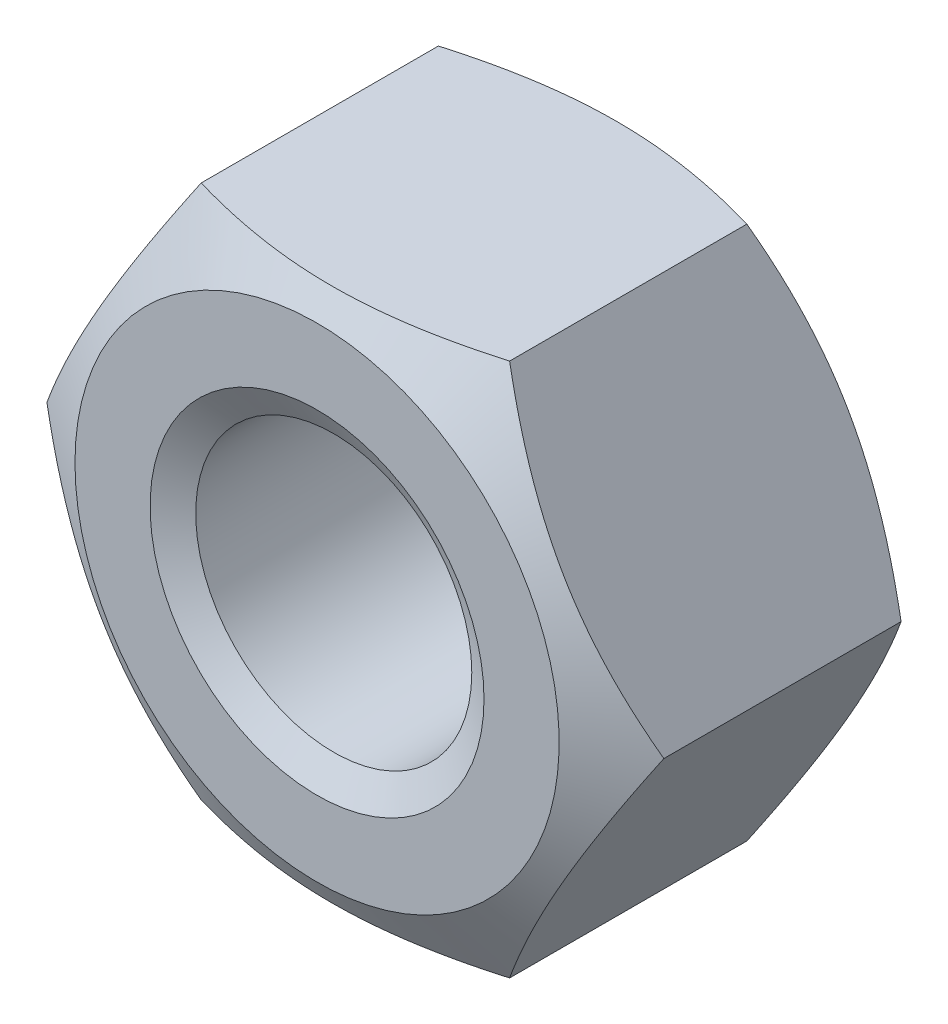
ISO-10303-21;
HEADER;
FILE_DESCRIPTION(('STEP AP214'),'2;1');
FILE_NAME('part.step','',(''),(''),'','','');
FILE_SCHEMA(('AUTOMOTIVE_DESIGN { 1 0 10303 214 1 1 1 1 }'));
ENDSEC;
DATA;
#1=APPLICATION_CONTEXT('core data for automotive mechanical design processes');
#2=APPLICATION_PROTOCOL_DEFINITION('international standard','automotive_design',2000,#1);
#3=PRODUCT_CONTEXT('',#1,'mechanical');
#4=PRODUCT('Part','Part','',(#3));
#5=PRODUCT_RELATED_PRODUCT_CATEGORY('part','',(#4));
#6=PRODUCT_DEFINITION_FORMATION('','',#4);
#7=PRODUCT_DEFINITION_CONTEXT('part definition',#1,'design');
#8=PRODUCT_DEFINITION('design','',#6,#7);
#9=PRODUCT_DEFINITION_SHAPE('','',#8);
#10=(LENGTH_UNIT() NAMED_UNIT(*) SI_UNIT(.MILLI.,.METRE.));
#11=(NAMED_UNIT(*) PLANE_ANGLE_UNIT() SI_UNIT($,.RADIAN.));
#12=(NAMED_UNIT(*) SI_UNIT($,.STERADIAN.) SOLID_ANGLE_UNIT());
#13=UNCERTAINTY_MEASURE_WITH_UNIT(LENGTH_MEASURE(1.E-05),#10,'distance_accuracy_value','');
#14=(GEOMETRIC_REPRESENTATION_CONTEXT(3) GLOBAL_UNCERTAINTY_ASSIGNED_CONTEXT((#13)) GLOBAL_UNIT_ASSIGNED_CONTEXT((#10,
#11,#12)) REPRESENTATION_CONTEXT('',''));
#15=CARTESIAN_POINT('',(0.,0.,0.));
#16=DIRECTION('',(0.,0.,1.));
#17=DIRECTION('',(1.,0.,0.));
#18=AXIS2_PLACEMENT_3D('',#15,#16,#17);
#19=CARTESIAN_POINT('',(2.3094010767585,-4.,-4.7));
#20=DIRECTION('',(0.866025403784439,-0.5,0.));
#21=DIRECTION('',(0.5,0.866025403784439,0.));
#22=AXIS2_PLACEMENT_3D('',#19,#20,#21);
#23=PLANE('',#22);
#24=CARTESIAN_POINT('',(2.30928560670466,-4.0002,-0.573838610020869));
#25=CARTESIAN_POINT('',(2.4107717464617,-3.82442084967677,-0.515224224594386));
#26=CARTESIAN_POINT('',(2.51313390883499,-3.64712438367362,-0.461916672408366));
#27=CARTESIAN_POINT('',(2.71963072479811,-3.28946140682429,-0.368868021692508));
#28=CARTESIAN_POINT('',(2.82376904741904,-3.10908854102985,-0.32915983997581));
#29=CARTESIAN_POINT('',(3.03075510011795,-2.75057818129721,-0.267348566226385));
#30=CARTESIAN_POINT('',(3.13357098372491,-2.57249584706486,-0.244834082468995));
#31=CARTESIAN_POINT('',(3.33968651028528,-2.21549328283349,-0.217956974092688));
#32=CARTESIAN_POINT('',(3.44298540411434,-2.0365743503559,-0.21357209237305));
#33=CARTESIAN_POINT('',(3.63600352522932,-1.70225715780327,-0.222696423886076));
#34=CARTESIAN_POINT('',(3.72575165335064,-1.54680884001294,-0.2339653049341));
#35=CARTESIAN_POINT('',(3.90466320392054,-1.23692494436495,-0.269680341744298));
#36=CARTESIAN_POINT('',(3.99382600759478,-1.08249043825587,-0.294138696657638));
#37=CARTESIAN_POINT('',(4.17310641015197,-0.771967672225422,-0.355282415865394));
#38=CARTESIAN_POINT('',(4.26320131938131,-0.615918711936898,-0.392226954600968));
#39=CARTESIAN_POINT('',(4.4420474282755,-0.30614816459616,-0.476076423494131));
#40=CARTESIAN_POINT('',(4.53080091904966,-0.15242260922622,-0.522961653158843));
#41=CARTESIAN_POINT('',(4.61891762357084,0.000200000000000348,-0.57383861002087));
#42=B_SPLINE_CURVE_WITH_KNOTS('',3,(#24,#25,#26,#27,#28,#29,#30,#31,#32,#33,#34,#35,#36,#37,#38,
#39,#40,#41),.UNSPECIFIED.,.F.,.F.,(4,2,2,2,2,2,2,2,4),(0.,0.634047835695965,1.26961969224543,
1.88946157213122,2.50854226669297,3.04757825393385,3.58711366126903,4.13861653143764,
4.68903648037743),.UNSPECIFIED.);
#43=CARTESIAN_POINT('',(2.30940107675851,-4.,-0.573771940854268));
#44=VERTEX_POINT('',#43);
#45=CARTESIAN_POINT('',(4.618802153517,0.,-0.573771940854268));
#46=VERTEX_POINT('',#45);
#47=EDGE_CURVE('E51',#44,#46,#42,.T.);
#48=ORIENTED_EDGE('',*,*,#47,.F.);
#49=DIRECTION('',(0.,0.,1.));
#50=VECTOR('',#49,1.);
#51=CARTESIAN_POINT('',(2.3094010767585,-4.,-4.7));
#52=LINE('',#51,#50);
#53=CARTESIAN_POINT('',(2.30940107675851,-4.,-4.12622805914573));
#54=VERTEX_POINT('',#53);
#55=EDGE_CURVE('E115',#54,#44,#52,.T.);
#56=ORIENTED_EDGE('',*,*,#55,.F.);
#57=CARTESIAN_POINT('',(4.61891762357084,0.000200000000000429,-4.12616138997913));
#58=CARTESIAN_POINT('',(4.5174314838138,-0.175579150323227,-4.18477577540562));
#59=CARTESIAN_POINT('',(4.41506932144051,-0.35287561632638,-4.23808332759163));
#60=CARTESIAN_POINT('',(4.20857250547739,-0.710538593175705,-4.33113197830749));
#61=CARTESIAN_POINT('',(4.10443418285647,-0.890911458970149,-4.37084016002419));
#62=CARTESIAN_POINT('',(3.89744813015756,-1.24942181870279,-4.43265143377362));
#63=CARTESIAN_POINT('',(3.79463224655059,-1.42750415293514,-4.45516591753101));
#64=CARTESIAN_POINT('',(3.58851671999023,-1.78450671716651,-4.48204302590731));
#65=CARTESIAN_POINT('',(3.48521782616117,-1.9634256496441,-4.48642790762695));
#66=CARTESIAN_POINT('',(3.29219970504619,-2.29774284219673,-4.47730357611392));
#67=CARTESIAN_POINT('',(3.20245157692486,-2.45319115998706,-4.4660346950659));
#68=CARTESIAN_POINT('',(3.02354002635497,-2.76307505563505,-4.4303196582557));
#69=CARTESIAN_POINT('',(2.93437722268072,-2.91750956174413,-4.40586130334236));
#70=CARTESIAN_POINT('',(2.75509682012354,-3.22803232777458,-4.34471758413461));
#71=CARTESIAN_POINT('',(2.6650019108942,-3.3840812880631,-4.30777304539903));
#72=CARTESIAN_POINT('',(2.48615580200001,-3.69385183540384,-4.22392357650587));
#73=CARTESIAN_POINT('',(2.39740231122585,-3.84757739077378,-4.17703834684116));
#74=CARTESIAN_POINT('',(2.30928560670466,-4.0002,-4.12616138997913));
#75=B_SPLINE_CURVE_WITH_KNOTS('',3,(#57,#58,#59,#60,#61,#62,#63,#64,#65,#66,#67,#68,#69,#70,#71,
#72,#73,#74),.UNSPECIFIED.,.F.,.F.,(4,2,2,2,2,2,2,2,4),(0.,0.634047835695965,1.26961969224543,
1.88946157213122,2.50854226669297,3.04757825393385,3.58711366126903,4.13861653143764,
4.68903648037743),.UNSPECIFIED.);
#76=CARTESIAN_POINT('',(4.61880215351701,0.,-4.12622805914573));
#77=VERTEX_POINT('',#76);
#78=EDGE_CURVE('E126',#77,#54,#75,.T.);
#79=ORIENTED_EDGE('',*,*,#78,.F.);
#80=DIRECTION('',(0.,0.,1.));
#81=VECTOR('',#80,1.);
#82=CARTESIAN_POINT('',(4.618802153517,0.,-4.7));
#83=LINE('',#82,#81);
#84=EDGE_CURVE('E123',#77,#46,#83,.T.);
#85=ORIENTED_EDGE('',*,*,#84,.T.);
#86=EDGE_LOOP('',(#48,#56,#79,#85));
#87=FACE_BOUND('',#86,.T.);
#88=ADVANCED_FACE('F36',(#87),#23,.T.);
#89=CARTESIAN_POINT('',(-2.30940107675851,-4.,-4.7));
#90=DIRECTION('',(0.,-1.,0.));
#91=DIRECTION('',(0.,0.,-1.));
#92=AXIS2_PLACEMENT_3D('',#89,#90,#91);
#93=PLANE('',#92);
#94=CARTESIAN_POINT('',(-6.09489331698854,-4.,-2.11613226172566));
#95=CARTESIAN_POINT('',(-5.91950199157587,-4.,-2.03149845459354));
#96=CARTESIAN_POINT('',(-5.74369257215839,-4.,-1.94771521780252));
#97=CARTESIAN_POINT('',(-5.39101133395399,-4.,-1.78233664211192));
#98=CARTESIAN_POINT('',(-5.21413933441671,-4.,-1.70074168913585));
#99=CARTESIAN_POINT('',(-4.85813636500876,-4.,-1.5397900151928));
#100=CARTESIAN_POINT('',(-4.67899824046454,-4.,-1.46044906153752));
#101=CARTESIAN_POINT('',(-4.31923849988323,-4.,-1.3052185148072));
#102=CARTESIAN_POINT('',(-4.13861696282555,-4.,-1.22932873937403));
#103=CARTESIAN_POINT('',(-3.7735011480398,-4.,-1.08107583924949));
#104=CARTESIAN_POINT('',(-3.58898622005784,-4.,-1.00876328992995));
#105=CARTESIAN_POINT('',(-3.21776937752919,-4.,-0.869876931081914));
#106=CARTESIAN_POINT('',(-3.03106722115794,-4.,-0.803303763044691));
#107=CARTESIAN_POINT('',(-2.65557248328835,-4.,-0.677706911420484));
#108=CARTESIAN_POINT('',(-2.46678541613765,-4.,-0.618666911849643));
#109=CARTESIAN_POINT('',(-2.08652902254126,-4.,-0.510073166124485));
#110=CARTESIAN_POINT('',(-1.8950605731911,-4.,-0.460516392299832));
#111=CARTESIAN_POINT('',(-1.50929874076661,-4.,-0.373311085934224));
#112=CARTESIAN_POINT('',(-1.31500426032993,-4.,-0.335667315782001));
#113=CARTESIAN_POINT('',(-0.924106700196859,-4.,-0.274847986643175));
#114=CARTESIAN_POINT('',(-0.727503612751564,-4.,-0.251672476233862));
#115=CARTESIAN_POINT('',(-0.33424068105691,-4.,-0.221840557573746));
#116=CARTESIAN_POINT('',(-0.137588730976598,-4.,-0.215082720352835));
#117=CARTESIAN_POINT('',(0.255527926525663,-4.,-0.218431875319074));
#118=CARTESIAN_POINT('',(0.451992668517271,-4.,-0.22853464227679));
#119=CARTESIAN_POINT('',(0.788354694254841,-4.,-0.259560117675916));
#120=CARTESIAN_POINT('',(0.928625472737156,-4.,-0.276641969876922));
#121=CARTESIAN_POINT('',(1.20806274563188,-4.,-0.318274124275841));
#122=CARTESIAN_POINT('',(1.34722906903656,-4.,-0.342825560735152));
#123=CARTESIAN_POINT('',(1.7632975044686,-4.,-0.426460434693978));
#124=CARTESIAN_POINT('',(2.03822284110857,-4.,-0.495467674952662));
#125=CARTESIAN_POINT('',(2.44940900931328,-4.,-0.614199979523692));
#126=CARTESIAN_POINT('',(2.58782303777094,-4.,-0.65688505084322));
#127=CARTESIAN_POINT('',(2.86331367399499,-4.,-0.746448608551733));
#128=CARTESIAN_POINT('',(3.00039016121332,-4.,-0.793327469111019));
#129=CARTESIAN_POINT('',(3.27252112795078,-4.,-0.89027873080736));
#130=CARTESIAN_POINT('',(3.40758266486629,-4.,-0.940331521678568));
#131=CARTESIAN_POINT('',(3.67656082616028,-4.,-1.04329523164377));
#132=CARTESIAN_POINT('',(3.81047782797028,-4.,-1.09620516281665));
#133=CARTESIAN_POINT('',(3.94391362275131,-4.,-1.15027525964541));
#134=B_SPLINE_CURVE_WITH_KNOTS('',3,(#94,#95,#96,#97,#98,#99,#100,#101,#102,#103,#104,#105,#106,
#107,#108,#109,#110,#111,#112,#113,#114,#115,#116,#117,#118,#119,#120,#121,#122,#123,#124,#125,
#126,#127,#128,#129,#130,#131,#132,#133),.UNSPECIFIED.,.F.,.F.,(4,2,2,2,2,2,2,2,2,2,2,2,2,2,2,2,
2,2,2,4),(0.,0.58423826026917,1.1685788875296,1.7563161578612,2.34402233634429,2.93848518113534,
3.53301438319362,4.12623321773499,4.71926234060198,5.31252823650209,5.90579612428623,
6.4953893548323,7.08483485682727,7.5085487103983,7.93232693734392,8.78152355201764,
9.21602908260414,9.65057341855462,10.0826543795838,10.5145868837227),.UNSPECIFIED.);
#135=CARTESIAN_POINT('',(-2.3094010767585,-4.,-0.573771940854268));
#136=VERTEX_POINT('',#135);
#137=EDGE_CURVE('E108',#136,#44,#134,.T.);
#138=ORIENTED_EDGE('',*,*,#137,.F.);
#139=DIRECTION('',(0.,0.,1.));
#140=VECTOR('',#139,1.);
#141=CARTESIAN_POINT('',(-2.30940107675851,-4.,-4.7));
#142=LINE('',#141,#140);
#143=CARTESIAN_POINT('',(-2.3094010767585,-4.00000000000001,-4.12622805914573));
#144=VERTEX_POINT('',#143);
#145=EDGE_CURVE('E107',#144,#136,#142,.T.);
#146=ORIENTED_EDGE('',*,*,#145,.F.);
#147=CARTESIAN_POINT('',(-6.09489331698854,-4.,-2.58386773827435));
#148=CARTESIAN_POINT('',(-5.91950199157587,-4.,-2.66850154540646));
#149=CARTESIAN_POINT('',(-5.74369257215839,-4.,-2.75228478219748));
#150=CARTESIAN_POINT('',(-5.39101133395399,-4.,-2.91766335788808));
#151=CARTESIAN_POINT('',(-5.21413933441671,-4.,-2.99925831086415));
#152=CARTESIAN_POINT('',(-4.85813636500876,-4.,-3.1602099848072));
#153=CARTESIAN_POINT('',(-4.67899824046454,-4.,-3.23955093846249));
#154=CARTESIAN_POINT('',(-4.31923849988323,-4.,-3.3947814851928));
#155=CARTESIAN_POINT('',(-4.13861696282555,-4.,-3.47067126062598));
#156=CARTESIAN_POINT('',(-3.7735011480398,-4.,-3.61892416075051));
#157=CARTESIAN_POINT('',(-3.58898622005784,-4.,-3.69123671007006));
#158=CARTESIAN_POINT('',(-3.21776937752919,-4.,-3.83012306891809));
#159=CARTESIAN_POINT('',(-3.03106722115794,-4.,-3.89669623695531));
#160=CARTESIAN_POINT('',(-2.65557248328835,-4.,-4.02229308857952));
#161=CARTESIAN_POINT('',(-2.46678541613765,-4.,-4.08133308815036));
#162=CARTESIAN_POINT('',(-2.08652902254126,-4.,-4.18992683387552));
#163=CARTESIAN_POINT('',(-1.8950605731911,-4.,-4.23948360770017));
#164=CARTESIAN_POINT('',(-1.50929874076661,-4.,-4.32668891406578));
#165=CARTESIAN_POINT('',(-1.31500426032993,-4.,-4.364332684218));
#166=CARTESIAN_POINT('',(-0.924106700196859,-4.,-4.42515201335682));
#167=CARTESIAN_POINT('',(-0.727503612751564,-4.,-4.44832752376614));
#168=CARTESIAN_POINT('',(-0.334240681056911,-4.,-4.47815944242625));
#169=CARTESIAN_POINT('',(-0.137588730976599,-4.,-4.48491727964717));
#170=CARTESIAN_POINT('',(0.255527926525662,-4.,-4.48156812468093));
#171=CARTESIAN_POINT('',(0.45199266851727,-4.,-4.47146535772321));
#172=CARTESIAN_POINT('',(0.78835469425484,-4.,-4.44043988232409));
#173=CARTESIAN_POINT('',(0.928625472737156,-4.,-4.42335803012308));
#174=CARTESIAN_POINT('',(1.20806274563188,-4.,-4.38172587572416));
#175=CARTESIAN_POINT('',(1.34722906903656,-4.,-4.35717443926485));
#176=CARTESIAN_POINT('',(1.7632975044686,-4.,-4.27353956530602));
#177=CARTESIAN_POINT('',(2.03822284110857,-4.,-4.20453232504734));
#178=CARTESIAN_POINT('',(2.44940900931328,-4.,-4.08580002047631));
#179=CARTESIAN_POINT('',(2.58782303777094,-4.,-4.04311494915678));
#180=CARTESIAN_POINT('',(2.86331367399499,-4.,-3.95355139144827));
#181=CARTESIAN_POINT('',(3.00039016121333,-4.,-3.90667253088898));
#182=CARTESIAN_POINT('',(3.27252112795078,-4.,-3.80972126919264));
#183=CARTESIAN_POINT('',(3.4075826648663,-4.,-3.75966847832143));
#184=CARTESIAN_POINT('',(3.67656082616028,-4.,-3.65670476835623));
#185=CARTESIAN_POINT('',(3.81047782797029,-4.,-3.60379483718335));
#186=CARTESIAN_POINT('',(3.94391362275132,-4.,-3.54972474035459));
#187=B_SPLINE_CURVE_WITH_KNOTS('',3,(#147,#148,#149,#150,#151,#152,#153,#154,#155,#156,#157,
#158,#159,#160,#161,#162,#163,#164,#165,#166,#167,#168,#169,#170,#171,#172,#173,#174,#175,#176,
#177,#178,#179,#180,#181,#182,#183,#184,#185,#186),.UNSPECIFIED.,.F.,.F.,(4,2,2,2,2,2,2,2,2,2,2,
2,2,2,2,2,2,2,2,4),(0.,0.584238260269169,1.1685788875296,1.7563161578612,2.34402233634429,
2.93848518113534,3.53301438319362,4.12623321773499,4.71926234060197,5.31252823650208,
5.90579612428623,6.4953893548323,7.08483485682726,7.5085487103983,7.93232693734391,
8.78152355201763,9.21602908260414,9.65057341855462,10.0826543795838,10.5145868837227),.UNSPECIFIED.);
#188=EDGE_CURVE('E202',#54,#144,#187,.F.);
#189=ORIENTED_EDGE('',*,*,#188,.F.);
#190=ORIENTED_EDGE('',*,*,#55,.T.);
#191=EDGE_LOOP('',(#138,#146,#189,#190));
#192=FACE_BOUND('',#191,.T.);
#193=ADVANCED_FACE('F212',(#192),#93,.T.);
#194=CARTESIAN_POINT('',(-4.61880215351701,0.,-4.7));
#195=DIRECTION('',(-0.866025403784439,-0.5,0.));
#196=DIRECTION('',(0.5,-0.866025403784439,0.));
#197=AXIS2_PLACEMENT_3D('',#194,#195,#196);
#198=PLANE('',#197);
#199=CARTESIAN_POINT('',(-4.61891762357085,0.000200000000001723,-0.573838610020873));
#200=CARTESIAN_POINT('',(-4.51743148381381,-0.175579150323226,-0.515224224594388));
#201=CARTESIAN_POINT('',(-4.41506932144052,-0.352875616326379,-0.461916672408369));
#202=CARTESIAN_POINT('',(-4.2085725054774,-0.710538593175704,-0.368868021692511));
#203=CARTESIAN_POINT('',(-4.10443418285647,-0.890911458970149,-0.329159839975812));
#204=CARTESIAN_POINT('',(-3.89744813015756,-1.24942181870279,-0.267348566226387));
#205=CARTESIAN_POINT('',(-3.7946322465506,-1.42750415293514,-0.244834082468997));
#206=CARTESIAN_POINT('',(-3.58851671999023,-1.78450671716651,-0.21795697409269));
#207=CARTESIAN_POINT('',(-3.48521782616117,-1.9634256496441,-0.213572092373051));
#208=CARTESIAN_POINT('',(-3.29219970504619,-2.29774284219673,-0.222696423886078));
#209=CARTESIAN_POINT('',(-3.20245157692487,-2.45319115998706,-0.233965304934101));
#210=CARTESIAN_POINT('',(-3.02354002635497,-2.76307505563505,-0.2696803417443));
#211=CARTESIAN_POINT('',(-2.93437722268073,-2.91750956174413,-0.294138696657639));
#212=CARTESIAN_POINT('',(-2.75509682012354,-3.22803232777458,-0.355282415865395));
#213=CARTESIAN_POINT('',(-2.6650019108942,-3.3840812880631,-0.392226954600969));
#214=CARTESIAN_POINT('',(-2.48615580200001,-3.69385183540384,-0.476076423494131));
#215=CARTESIAN_POINT('',(-2.39740231122585,-3.84757739077378,-0.522961653158844));
#216=CARTESIAN_POINT('',(-2.30928560670467,-4.0002,-0.57383861002087));
#217=B_SPLINE_CURVE_WITH_KNOTS('',3,(#199,#200,#201,#202,#203,#204,#205,#206,#207,#208,#209,
#210,#211,#212,#213,#214,#215,#216),.UNSPECIFIED.,.F.,.F.,(4,2,2,2,2,2,2,2,4),(0.,
0.634047835695965,1.26961969224543,1.88946157213122,2.50854226669297,3.04757825393386,
3.58711366126903,4.13861653143764,4.68903648037743),.UNSPECIFIED.);
#218=CARTESIAN_POINT('',(-4.61880215351701,0.,-0.573771940854268));
#219=VERTEX_POINT('',#218);
#220=EDGE_CURVE('E91',#219,#136,#217,.T.);
#221=ORIENTED_EDGE('',*,*,#220,.F.);
#222=DIRECTION('',(0.,0.,1.));
#223=VECTOR('',#222,1.);
#224=CARTESIAN_POINT('',(-4.61880215351701,0.,-4.7));
#225=LINE('',#224,#223);
#226=CARTESIAN_POINT('',(-4.61880215351701,0.,-4.12622805914573));
#227=VERTEX_POINT('',#226);
#228=EDGE_CURVE('E105',#227,#219,#225,.T.);
#229=ORIENTED_EDGE('',*,*,#228,.F.);
#230=CARTESIAN_POINT('',(-2.30928560670467,-4.0002,-4.12616138997913));
#231=CARTESIAN_POINT('',(-2.41077174646171,-3.82442084967677,-4.18477577540561));
#232=CARTESIAN_POINT('',(-2.513133908835,-3.64712438367362,-4.23808332759163));
#233=CARTESIAN_POINT('',(-2.71963072479812,-3.28946140682429,-4.33113197830749));
#234=CARTESIAN_POINT('',(-2.82376904741904,-3.10908854102985,-4.37084016002419));
#235=CARTESIAN_POINT('',(-3.03075510011795,-2.75057818129721,-4.43265143377361));
#236=CARTESIAN_POINT('',(-3.13357098372492,-2.57249584706486,-4.455165917531));
#237=CARTESIAN_POINT('',(-3.33968651028528,-2.21549328283349,-4.48204302590731));
#238=CARTESIAN_POINT('',(-3.44298540411434,-2.0365743503559,-4.48642790762695));
#239=CARTESIAN_POINT('',(-3.63600352522932,-1.70225715780327,-4.47730357611392));
#240=CARTESIAN_POINT('',(-3.72575165335065,-1.54680884001294,-4.4660346950659));
#241=CARTESIAN_POINT('',(-3.90466320392054,-1.23692494436494,-4.4303196582557));
#242=CARTESIAN_POINT('',(-3.99382600759479,-1.08249043825587,-4.40586130334236));
#243=CARTESIAN_POINT('',(-4.17310641015197,-0.771967672225422,-4.3447175841346));
#244=CARTESIAN_POINT('',(-4.26320131938131,-0.615918711936897,-4.30777304539903));
#245=CARTESIAN_POINT('',(-4.44204742827551,-0.30614816459616,-4.22392357650587));
#246=CARTESIAN_POINT('',(-4.53080091904967,-0.15242260922622,-4.17703834684115));
#247=CARTESIAN_POINT('',(-4.61891762357085,0.000200000000001465,-4.12616138997913));
#248=B_SPLINE_CURVE_WITH_KNOTS('',3,(#230,#231,#232,#233,#234,#235,#236,#237,#238,#239,#240,
#241,#242,#243,#244,#245,#246,#247),.UNSPECIFIED.,.F.,.F.,(4,2,2,2,2,2,2,2,4),(0.,
0.634047835695965,1.26961969224543,1.88946157213122,2.50854226669297,3.04757825393385,
3.58711366126903,4.13861653143764,4.68903648037743),.UNSPECIFIED.);
#249=EDGE_CURVE('E195',#144,#227,#248,.T.);
#250=ORIENTED_EDGE('',*,*,#249,.F.);
#251=ORIENTED_EDGE('',*,*,#145,.T.);
#252=EDGE_LOOP('',(#221,#229,#250,#251));
#253=FACE_BOUND('',#252,.T.);
#254=ADVANCED_FACE('F103',(#253),#198,.T.);
#255=CARTESIAN_POINT('',(-2.30940107675851,4.,-4.7));
#256=DIRECTION('',(-0.866025403784439,0.5,0.));
#257=DIRECTION('',(-0.5,-0.866025403784439,0.));
#258=AXIS2_PLACEMENT_3D('',#255,#256,#257);
#259=PLANE('',#258);
#260=CARTESIAN_POINT('',(-2.30928560670467,4.0002,-0.573838610020872));
#261=CARTESIAN_POINT('',(-2.41077174646171,3.82442084967677,-0.515224224594388));
#262=CARTESIAN_POINT('',(-2.513133908835,3.64712438367362,-0.461916672408369));
#263=CARTESIAN_POINT('',(-2.71963072479812,3.28946140682429,-0.368868021692511));
#264=CARTESIAN_POINT('',(-2.82376904741905,3.10908854102985,-0.329159839975812));
#265=CARTESIAN_POINT('',(-3.03075510011795,2.75057818129721,-0.267348566226387));
#266=CARTESIAN_POINT('',(-3.13357098372492,2.57249584706486,-0.244834082468998));
#267=CARTESIAN_POINT('',(-3.33968651028529,2.21549328283349,-0.217956974092691));
#268=CARTESIAN_POINT('',(-3.44298540411434,2.0365743503559,-0.213572092373052));
#269=CARTESIAN_POINT('',(-3.63600352522933,1.70225715780327,-0.222696423886079));
#270=CARTESIAN_POINT('',(-3.72575165335065,1.54680884001294,-0.233965304934103));
#271=CARTESIAN_POINT('',(-3.90466320392055,1.23692494436495,-0.269680341744302));
#272=CARTESIAN_POINT('',(-3.99382600759479,1.08249043825587,-0.294138696657641));
#273=CARTESIAN_POINT('',(-4.17310641015197,0.771967672225423,-0.355282415865397));
#274=CARTESIAN_POINT('',(-4.26320131938131,0.6159187119369,-0.392226954600971));
#275=CARTESIAN_POINT('',(-4.44204742827551,0.306148164596163,-0.476076423494134));
#276=CARTESIAN_POINT('',(-4.53080091904967,0.152422609226223,-0.522961653158847));
#277=CARTESIAN_POINT('',(-4.61891762357085,-0.000199999999998026,-0.573838610020872));
#278=B_SPLINE_CURVE_WITH_KNOTS('',3,(#260,#261,#262,#263,#264,#265,#266,#267,#268,#269,#270,
#271,#272,#273,#274,#275,#276,#277),.UNSPECIFIED.,.F.,.F.,(4,2,2,2,2,2,2,2,4),(0.,
0.634047835695965,1.26961969224543,1.88946157213122,2.50854226669297,3.04757825393385,
3.58711366126903,4.13861653143763,4.68903648037743),.UNSPECIFIED.);
#279=CARTESIAN_POINT('',(-2.30940107675851,4.,-0.573771940854268));
#280=VERTEX_POINT('',#279);
#281=EDGE_CURVE('E87',#280,#219,#278,.T.);
#282=ORIENTED_EDGE('',*,*,#281,.F.);
#283=DIRECTION('',(0.,0.,1.));
#284=VECTOR('',#283,1.);
#285=CARTESIAN_POINT('',(-2.30940107675851,4.,-4.7));
#286=LINE('',#285,#284);
#287=CARTESIAN_POINT('',(-2.30940107675851,4.,-4.12622805914573));
#288=VERTEX_POINT('',#287);
#289=EDGE_CURVE('E113',#288,#280,#286,.T.);
#290=ORIENTED_EDGE('',*,*,#289,.F.);
#291=CARTESIAN_POINT('',(-4.61891762357085,-0.000199999999998203,-4.12616138997913));
#292=CARTESIAN_POINT('',(-4.51743148381381,0.17557915032323,-4.18477577540561));
#293=CARTESIAN_POINT('',(-4.41506932144052,0.352875616326383,-4.23808332759163));
#294=CARTESIAN_POINT('',(-4.2085725054774,0.710538593175708,-4.33113197830749));
#295=CARTESIAN_POINT('',(-4.10443418285647,0.890911458970152,-4.37084016002419));
#296=CARTESIAN_POINT('',(-3.89744813015756,1.24942181870279,-4.43265143377361));
#297=CARTESIAN_POINT('',(-3.7946322465506,1.42750415293514,-4.455165917531));
#298=CARTESIAN_POINT('',(-3.58851671999023,1.78450671716651,-4.48204302590731));
#299=CARTESIAN_POINT('',(-3.48521782616117,1.9634256496441,-4.48642790762695));
#300=CARTESIAN_POINT('',(-3.29219970504619,2.29774284219673,-4.47730357611392));
#301=CARTESIAN_POINT('',(-3.20245157692487,2.45319115998707,-4.4660346950659));
#302=CARTESIAN_POINT('',(-3.02354002635497,2.76307505563506,-4.4303196582557));
#303=CARTESIAN_POINT('',(-2.93437722268073,2.91750956174413,-4.40586130334236));
#304=CARTESIAN_POINT('',(-2.75509682012354,3.22803232777458,-4.3447175841346));
#305=CARTESIAN_POINT('',(-2.6650019108942,3.3840812880631,-4.30777304539903));
#306=CARTESIAN_POINT('',(-2.48615580200001,3.69385183540384,-4.22392357650587));
#307=CARTESIAN_POINT('',(-2.39740231122585,3.84757739077378,-4.17703834684116));
#308=CARTESIAN_POINT('',(-2.30928560670467,4.0002,-4.12616138997913));
#309=B_SPLINE_CURVE_WITH_KNOTS('',3,(#291,#292,#293,#294,#295,#296,#297,#298,#299,#300,#301,
#302,#303,#304,#305,#306,#307,#308),.UNSPECIFIED.,.F.,.F.,(4,2,2,2,2,2,2,2,4),(0.,
0.634047835695965,1.26961969224543,1.88946157213122,2.50854226669297,3.04757825393385,
3.58711366126903,4.13861653143763,4.68903648037743),.UNSPECIFIED.);
#310=EDGE_CURVE('E112',#227,#288,#309,.T.);
#311=ORIENTED_EDGE('',*,*,#310,.F.);
#312=ORIENTED_EDGE('',*,*,#228,.T.);
#313=EDGE_LOOP('',(#282,#290,#311,#312));
#314=FACE_BOUND('',#313,.T.);
#315=ADVANCED_FACE('F111',(#314),#259,.T.);
#316=CARTESIAN_POINT('',(2.3094010767585,4.,-4.7));
#317=DIRECTION('',(0.,1.,0.));
#318=DIRECTION('',(0.,0.,1.));
#319=AXIS2_PLACEMENT_3D('',#316,#317,#318);
#320=PLANE('',#319);
#321=CARTESIAN_POINT('',(-6.09489331698855,4.,-2.11613226172566));
#322=CARTESIAN_POINT('',(-5.91950199157587,4.,-2.03149845459354));
#323=CARTESIAN_POINT('',(-5.74369257215839,4.,-1.94771521780252));
#324=CARTESIAN_POINT('',(-5.39101133395399,4.,-1.78233664211192));
#325=CARTESIAN_POINT('',(-5.21413933441671,4.,-1.70074168913585));
#326=CARTESIAN_POINT('',(-4.85813636500876,4.,-1.53979001519281));
#327=CARTESIAN_POINT('',(-4.67899824046454,4.,-1.46044906153752));
#328=CARTESIAN_POINT('',(-4.31923849988324,4.,-1.3052185148072));
#329=CARTESIAN_POINT('',(-4.13861696282555,4.,-1.22932873937403));
#330=CARTESIAN_POINT('',(-3.77350114803981,4.,-1.08107583924949));
#331=CARTESIAN_POINT('',(-3.58898622005784,4.,-1.00876328992995));
#332=CARTESIAN_POINT('',(-3.21776937752919,4.,-0.869876931081915));
#333=CARTESIAN_POINT('',(-3.03106722115794,4.,-0.803303763044692));
#334=CARTESIAN_POINT('',(-2.65557248328835,4.,-0.677706911420485));
#335=CARTESIAN_POINT('',(-2.46678541613765,4.,-0.618666911849644));
#336=CARTESIAN_POINT('',(-2.08652902254126,4.,-0.510073166124486));
#337=CARTESIAN_POINT('',(-1.8950605731911,4.,-0.460516392299832));
#338=CARTESIAN_POINT('',(-1.50929874076661,4.,-0.373311085934224));
#339=CARTESIAN_POINT('',(-1.31500426032993,4.,-0.335667315782002));
#340=CARTESIAN_POINT('',(-0.924106700196859,4.,-0.274847986643175));
#341=CARTESIAN_POINT('',(-0.727503612751564,4.,-0.251672476233863));
#342=CARTESIAN_POINT('',(-0.334240681056911,4.,-0.221840557573747));
#343=CARTESIAN_POINT('',(-0.137588730976598,4.,-0.215082720352835));
#344=CARTESIAN_POINT('',(0.255527926525663,4.,-0.218431875319075));
#345=CARTESIAN_POINT('',(0.451992668517271,4.,-0.228534642276791));
#346=CARTESIAN_POINT('',(0.788354694254839,4.,-0.259560117675916));
#347=CARTESIAN_POINT('',(0.928625472737155,4.,-0.276641969876922));
#348=CARTESIAN_POINT('',(1.20806274563188,4.,-0.31827412427584));
#349=CARTESIAN_POINT('',(1.34722906903655,4.,-0.342825560735152));
#350=CARTESIAN_POINT('',(1.7632975044686,4.,-0.426460434693978));
#351=CARTESIAN_POINT('',(2.03822284110856,4.,-0.495467674952661));
#352=CARTESIAN_POINT('',(2.44940900931328,4.,-0.614199979523691));
#353=CARTESIAN_POINT('',(2.58782303777093,4.,-0.65688505084322));
#354=CARTESIAN_POINT('',(2.86331367399498,4.,-0.746448608551733));
#355=CARTESIAN_POINT('',(3.00039016121332,4.,-0.793327469111019));
#356=CARTESIAN_POINT('',(3.27252112795078,4.,-0.89027873080736));
#357=CARTESIAN_POINT('',(3.40758266486629,4.,-0.940331521678568));
#358=CARTESIAN_POINT('',(3.67656082616028,4.,-1.04329523164377));
#359=CARTESIAN_POINT('',(3.81047782797028,4.,-1.09620516281665));
#360=CARTESIAN_POINT('',(3.94391362275132,4.,-1.15027525964541));
#361=B_SPLINE_CURVE_WITH_KNOTS('',3,(#321,#322,#323,#324,#325,#326,#327,#328,#329,#330,#331,
#332,#333,#334,#335,#336,#337,#338,#339,#340,#341,#342,#343,#344,#345,#346,#347,#348,#349,#350,
#351,#352,#353,#354,#355,#356,#357,#358,#359,#360),.UNSPECIFIED.,.F.,.F.,(4,2,2,2,2,2,2,2,2,2,2,
2,2,2,2,2,2,2,2,4),(0.,0.58423826026917,1.1685788875296,1.7563161578612,2.34402233634429,
2.93848518113534,3.53301438319362,4.12623321773499,4.71926234060198,5.31252823650209,
5.90579612428623,6.49538935483231,7.08483485682727,7.5085487103983,7.93232693734392,
8.78152355201763,9.21602908260414,9.65057341855462,10.0826543795838,10.5145868837227),.UNSPECIFIED.);
#362=CARTESIAN_POINT('',(2.30940107675849,4.00000000000001,-0.573771940854268));
#363=VERTEX_POINT('',#362);
#364=EDGE_CURVE('E94',#363,#280,#361,.F.);
#365=ORIENTED_EDGE('',*,*,#364,.F.);
#366=DIRECTION('',(0.,0.,1.));
#367=VECTOR('',#366,1.);
#368=CARTESIAN_POINT('',(2.3094010767585,4.,-4.7));
#369=LINE('',#368,#367);
#370=CARTESIAN_POINT('',(2.3094010767585,4.,-4.12622805914573));
#371=VERTEX_POINT('',#370);
#372=EDGE_CURVE('E117',#371,#363,#369,.T.);
#373=ORIENTED_EDGE('',*,*,#372,.F.);
#374=CARTESIAN_POINT('',(-6.09489331698854,4.,-2.58386773827435));
#375=CARTESIAN_POINT('',(-5.91950199157587,4.,-2.66850154540646));
#376=CARTESIAN_POINT('',(-5.74369257215839,4.,-2.75228478219748));
#377=CARTESIAN_POINT('',(-5.39101133395399,4.,-2.91766335788808));
#378=CARTESIAN_POINT('',(-5.21413933441671,4.,-2.99925831086415));
#379=CARTESIAN_POINT('',(-4.85813636500876,4.,-3.1602099848072));
#380=CARTESIAN_POINT('',(-4.67899824046454,4.,-3.23955093846249));
#381=CARTESIAN_POINT('',(-4.31923849988323,4.,-3.3947814851928));
#382=CARTESIAN_POINT('',(-4.13861696282555,4.,-3.47067126062598));
#383=CARTESIAN_POINT('',(-3.77350114803981,4.,-3.61892416075051));
#384=CARTESIAN_POINT('',(-3.58898622005784,4.,-3.69123671007006));
#385=CARTESIAN_POINT('',(-3.21776937752919,4.,-3.83012306891809));
#386=CARTESIAN_POINT('',(-3.03106722115794,4.,-3.89669623695531));
#387=CARTESIAN_POINT('',(-2.65557248328835,4.,-4.02229308857952));
#388=CARTESIAN_POINT('',(-2.46678541613765,4.,-4.08133308815036));
#389=CARTESIAN_POINT('',(-2.08652902254126,4.,-4.18992683387552));
#390=CARTESIAN_POINT('',(-1.8950605731911,4.,-4.23948360770017));
#391=CARTESIAN_POINT('',(-1.50929874076661,4.,-4.32668891406578));
#392=CARTESIAN_POINT('',(-1.31500426032993,4.,-4.364332684218));
#393=CARTESIAN_POINT('',(-0.92410670019686,4.,-4.42515201335682));
#394=CARTESIAN_POINT('',(-0.727503612751565,4.,-4.44832752376614));
#395=CARTESIAN_POINT('',(-0.334240681056912,4.,-4.47815944242625));
#396=CARTESIAN_POINT('',(-0.137588730976599,4.,-4.48491727964717));
#397=CARTESIAN_POINT('',(0.255527926525661,4.,-4.48156812468093));
#398=CARTESIAN_POINT('',(0.451992668517269,4.,-4.47146535772321));
#399=CARTESIAN_POINT('',(0.788354694254839,4.,-4.44043988232408));
#400=CARTESIAN_POINT('',(0.928625472737155,4.,-4.42335803012308));
#401=CARTESIAN_POINT('',(1.20806274563188,4.,-4.38172587572416));
#402=CARTESIAN_POINT('',(1.34722906903656,4.,-4.35717443926485));
#403=CARTESIAN_POINT('',(1.7632975044686,4.,-4.27353956530602));
#404=CARTESIAN_POINT('',(2.03822284110857,4.,-4.20453232504734));
#405=CARTESIAN_POINT('',(2.44940900931328,4.,-4.08580002047631));
#406=CARTESIAN_POINT('',(2.58782303777094,4.,-4.04311494915678));
#407=CARTESIAN_POINT('',(2.86331367399499,4.,-3.95355139144827));
#408=CARTESIAN_POINT('',(3.00039016121333,4.,-3.90667253088898));
#409=CARTESIAN_POINT('',(3.27252112795078,4.,-3.80972126919264));
#410=CARTESIAN_POINT('',(3.40758266486629,4.,-3.75966847832143));
#411=CARTESIAN_POINT('',(3.67656082616028,4.,-3.65670476835623));
#412=CARTESIAN_POINT('',(3.81047782797029,4.,-3.60379483718335));
#413=CARTESIAN_POINT('',(3.94391362275132,4.,-3.54972474035459));
#414=B_SPLINE_CURVE_WITH_KNOTS('',3,(#374,#375,#376,#377,#378,#379,#380,#381,#382,#383,#384,
#385,#386,#387,#388,#389,#390,#391,#392,#393,#394,#395,#396,#397,#398,#399,#400,#401,#402,#403,
#404,#405,#406,#407,#408,#409,#410,#411,#412,#413),.UNSPECIFIED.,.F.,.F.,(4,2,2,2,2,2,2,2,2,2,2,
2,2,2,2,2,2,2,2,4),(0.,0.584238260269169,1.1685788875296,1.7563161578612,2.34402233634429,
2.93848518113534,3.53301438319361,4.12623321773499,4.71926234060197,5.31252823650208,
5.90579612428622,6.4953893548323,7.08483485682726,7.5085487103983,7.93232693734391,
8.78152355201763,9.21602908260414,9.65057341855461,10.0826543795838,10.5145868837227),.UNSPECIFIED.);
#415=EDGE_CURVE('E59',#288,#371,#414,.T.);
#416=ORIENTED_EDGE('',*,*,#415,.F.);
#417=ORIENTED_EDGE('',*,*,#289,.T.);
#418=EDGE_LOOP('',(#365,#373,#416,#417));
#419=FACE_BOUND('',#418,.T.);
#420=ADVANCED_FACE('F239',(#419),#320,.T.);
#421=CARTESIAN_POINT('',(4.618802153517,0.,-4.7));
#422=DIRECTION('',(0.866025403784438,0.5,0.));
#423=DIRECTION('',(-0.5,0.866025403784438,0.));
#424=AXIS2_PLACEMENT_3D('',#421,#422,#423);
#425=PLANE('',#424);
#426=CARTESIAN_POINT('',(4.61891762357084,-0.000199999999999639,-0.57383861002087));
#427=CARTESIAN_POINT('',(4.5174314838138,0.175579150323228,-0.515224224594385));
#428=CARTESIAN_POINT('',(4.41506932144051,0.35287561632638,-0.461916672408366));
#429=CARTESIAN_POINT('',(4.20857250547739,0.710538593175706,-0.368868021692508));
#430=CARTESIAN_POINT('',(4.10443418285647,0.89091145897015,-0.32915983997581));
#431=CARTESIAN_POINT('',(3.89744813015756,1.24942181870279,-0.267348566226385));
#432=CARTESIAN_POINT('',(3.79463224655059,1.42750415293514,-0.244834082468995));
#433=CARTESIAN_POINT('',(3.58851671999023,1.78450671716651,-0.217956974092688));
#434=CARTESIAN_POINT('',(3.48521782616117,1.9634256496441,-0.213572092373049));
#435=CARTESIAN_POINT('',(3.29219970504619,2.29774284219673,-0.222696423886076));
#436=CARTESIAN_POINT('',(3.20245157692486,2.45319115998706,-0.2339653049341));
#437=CARTESIAN_POINT('',(3.02354002635496,2.76307505563505,-0.269680341744298));
#438=CARTESIAN_POINT('',(2.93437722268072,2.91750956174413,-0.294138696657638));
#439=CARTESIAN_POINT('',(2.75509682012354,3.22803232777458,-0.355282415865394));
#440=CARTESIAN_POINT('',(2.6650019108942,3.3840812880631,-0.392226954600967));
#441=CARTESIAN_POINT('',(2.486155802,3.69385183540384,-0.47607642349413));
#442=CARTESIAN_POINT('',(2.39740231122584,3.84757739077378,-0.522961653158843));
#443=CARTESIAN_POINT('',(2.30928560670466,4.0002,-0.573838610020869));
#444=B_SPLINE_CURVE_WITH_KNOTS('',3,(#426,#427,#428,#429,#430,#431,#432,#433,#434,#435,#436,
#437,#438,#439,#440,#441,#442,#443),.UNSPECIFIED.,.F.,.F.,(4,2,2,2,2,2,2,2,4),(0.,
0.634047835695965,1.26961969224543,1.88946157213122,2.50854226669297,3.04757825393385,
3.58711366126903,4.13861653143764,4.68903648037743),.UNSPECIFIED.);
#445=EDGE_CURVE('E261',#46,#363,#444,.T.);
#446=ORIENTED_EDGE('',*,*,#445,.F.);
#447=ORIENTED_EDGE('',*,*,#84,.F.);
#448=CARTESIAN_POINT('',(2.30928560670466,4.0002,-4.12616138997913));
#449=CARTESIAN_POINT('',(2.4107717464617,3.82442084967677,-4.18477577540562));
#450=CARTESIAN_POINT('',(2.51313390883499,3.64712438367362,-4.23808332759163));
#451=CARTESIAN_POINT('',(2.71963072479811,3.28946140682429,-4.33113197830749));
#452=CARTESIAN_POINT('',(2.82376904741904,3.10908854102985,-4.37084016002419));
#453=CARTESIAN_POINT('',(3.03075510011795,2.75057818129721,-4.43265143377362));
#454=CARTESIAN_POINT('',(3.13357098372491,2.57249584706486,-4.45516591753101));
#455=CARTESIAN_POINT('',(3.33968651028528,2.21549328283349,-4.48204302590731));
#456=CARTESIAN_POINT('',(3.44298540411434,2.0365743503559,-4.48642790762695));
#457=CARTESIAN_POINT('',(3.63600352522932,1.70225715780327,-4.47730357611392));
#458=CARTESIAN_POINT('',(3.72575165335064,1.54680884001294,-4.4660346950659));
#459=CARTESIAN_POINT('',(3.90466320392054,1.23692494436495,-4.4303196582557));
#460=CARTESIAN_POINT('',(3.99382600759478,1.08249043825587,-4.40586130334236));
#461=CARTESIAN_POINT('',(4.17310641015197,0.771967672225423,-4.34471758413461));
#462=CARTESIAN_POINT('',(4.26320131938131,0.615918711936899,-4.30777304539903));
#463=CARTESIAN_POINT('',(4.4420474282755,0.306148164596161,-4.22392357650587));
#464=CARTESIAN_POINT('',(4.53080091904966,0.152422609226221,-4.17703834684116));
#465=CARTESIAN_POINT('',(4.61891762357084,-0.000199999999999644,-4.12616138997913));
#466=B_SPLINE_CURVE_WITH_KNOTS('',3,(#448,#449,#450,#451,#452,#453,#454,#455,#456,#457,#458,
#459,#460,#461,#462,#463,#464,#465),.UNSPECIFIED.,.F.,.F.,(4,2,2,2,2,2,2,2,4),(0.,
0.634047835695965,1.26961969224543,1.88946157213122,2.50854226669297,3.04757825393385,
3.58711366126903,4.13861653143764,4.68903648037743),.UNSPECIFIED.);
#467=EDGE_CURVE('E153',#371,#77,#466,.T.);
#468=ORIENTED_EDGE('',*,*,#467,.F.);
#469=ORIENTED_EDGE('',*,*,#372,.T.);
#470=EDGE_LOOP('',(#446,#447,#468,#469));
#471=FACE_BOUND('',#470,.T.);
#472=ADVANCED_FACE('F147',(#471),#425,.T.);
#473=CARTESIAN_POINT('',(4.61880215351701,0.,-4.7));
#474=DIRECTION('',(0.,0.,1.));
#475=DIRECTION('',(1.,0.,0.));
#476=AXIS2_PLACEMENT_3D('',#473,#474,#475);
#477=PLANE('',#476);
#478=CARTESIAN_POINT('',(0.,0.,-4.7));
#479=DIRECTION('',(0.,0.,1.));
#480=DIRECTION('',(1.,0.,0.));
#481=AXIS2_PLACEMENT_3D('',#478,#479,#480);
#482=CIRCLE('',#481,2.31699266655911);
#483=CARTESIAN_POINT('',(2.31699266655911,0.,-4.7));
#484=VERTEX_POINT('',#483);
#485=EDGE_CURVE('E127',#484,#484,#482,.T.);
#486=ORIENTED_EDGE('',*,*,#485,.T.);
#487=EDGE_LOOP('',(#486));
#488=FACE_BOUND('',#487,.T.);
#489=CARTESIAN_POINT('',(0.,0.,-4.7));
#490=DIRECTION('',(0.,0.,-1.));
#491=DIRECTION('',(-1.,0.,0.));
#492=AXIS2_PLACEMENT_3D('',#489,#490,#491);
#493=CIRCLE('',#492,3.625);
#494=CARTESIAN_POINT('',(-3.625,0.,-4.7));
#495=VERTEX_POINT('',#494);
#496=EDGE_CURVE('E151',#495,#495,#493,.T.);
#497=ORIENTED_EDGE('',*,*,#496,.T.);
#498=EDGE_LOOP('',(#497));
#499=FACE_BOUND('',#498,.T.);
#500=ADVANCED_FACE('F143',(#488,#499),#477,.F.);
#501=CARTESIAN_POINT('',(4.61880215351701,0.,0.));
#502=DIRECTION('',(0.,0.,1.));
#503=DIRECTION('',(1.,0.,0.));
#504=AXIS2_PLACEMENT_3D('',#501,#502,#503);
#505=PLANE('',#504);
#506=CARTESIAN_POINT('',(0.,0.,0.));
#507=DIRECTION('',(0.,0.,1.));
#508=DIRECTION('',(1.,0.,0.));
#509=AXIS2_PLACEMENT_3D('',#506,#507,#508);
#510=CIRCLE('',#509,2.5);
#511=CARTESIAN_POINT('',(2.5,0.,0.));
#512=VERTEX_POINT('',#511);
#513=EDGE_CURVE('E11',#512,#512,#510,.F.);
#514=ORIENTED_EDGE('',*,*,#513,.T.);
#515=EDGE_LOOP('',(#514));
#516=FACE_BOUND('',#515,.T.);
#517=CARTESIAN_POINT('',(0.,0.,0.));
#518=DIRECTION('',(0.,0.,-1.));
#519=DIRECTION('',(-1.,0.,0.));
#520=AXIS2_PLACEMENT_3D('',#517,#518,#519);
#521=CIRCLE('',#520,3.625);
#522=CARTESIAN_POINT('',(-3.625,0.,0.));
#523=VERTEX_POINT('',#522);
#524=EDGE_CURVE('E262',#523,#523,#521,.T.);
#525=ORIENTED_EDGE('',*,*,#524,.F.);
#526=EDGE_LOOP('',(#525));
#527=FACE_BOUND('',#526,.T.);
#528=ADVANCED_FACE('F146',(#516,#527),#505,.T.);
#529=CARTESIAN_POINT('',(0.,0.,-4.7));
#530=DIRECTION('',(0.,0.,1.));
#531=DIRECTION('',(1.,0.,0.));
#532=AXIS2_PLACEMENT_3D('',#529,#530,#531);
#533=CYLINDRICAL_SURFACE('',#532,2.067);
#534=CARTESIAN_POINT('',(0.,0.,-4.26699999999999));
#535=DIRECTION('',(0.,0.,1.));
#536=DIRECTION('',(1.,0.,0.));
#537=AXIS2_PLACEMENT_3D('',#534,#535,#536);
#538=CIRCLE('',#537,2.067);
#539=CARTESIAN_POINT('',(2.067,0.,-4.26699999999999));
#540=VERTEX_POINT('',#539);
#541=EDGE_CURVE('E44',#540,#540,#538,.F.);
#542=ORIENTED_EDGE('',*,*,#541,.T.);
#543=EDGE_LOOP('',(#542));
#544=FACE_BOUND('',#543,.T.);
#545=CARTESIAN_POINT('',(0.,0.,-0.249992666559108));
#546=DIRECTION('',(0.,0.,1.));
#547=DIRECTION('',(1.,0.,0.));
#548=AXIS2_PLACEMENT_3D('',#545,#546,#547);
#549=CIRCLE('',#548,2.067);
#550=CARTESIAN_POINT('',(2.067,0.,-0.249992666559108));
#551=VERTEX_POINT('',#550);
#552=EDGE_CURVE('E130',#551,#551,#549,.T.);
#553=ORIENTED_EDGE('',*,*,#552,.T.);
#554=EDGE_LOOP('',(#553));
#555=FACE_BOUND('',#554,.T.);
#556=ADVANCED_FACE('F135',(#544,#555),#533,.F.);
#557=CARTESIAN_POINT('',(0.,0.,-4.12622805914573));
#558=DIRECTION('',(0.,0.,1.));
#559=DIRECTION('',(1.,0.,0.));
#560=AXIS2_PLACEMENT_3D('',#557,#558,#559);
#561=CONICAL_SURFACE('',#560,4.61880215351701,1.0471975511966);
#562=ORIENTED_EDGE('',*,*,#78,.T.);
#563=ORIENTED_EDGE('',*,*,#188,.T.);
#564=ORIENTED_EDGE('',*,*,#249,.T.);
#565=ORIENTED_EDGE('',*,*,#310,.T.);
#566=ORIENTED_EDGE('',*,*,#415,.T.);
#567=ORIENTED_EDGE('',*,*,#467,.T.);
#568=EDGE_LOOP('',(#562,#563,#564,#565,#566,#567));
#569=FACE_BOUND('',#568,.T.);
#570=ORIENTED_EDGE('',*,*,#496,.F.);
#571=EDGE_LOOP('',(#570));
#572=FACE_BOUND('',#571,.T.);
#573=ADVANCED_FACE('F178',(#569,#572),#561,.T.);
#574=CARTESIAN_POINT('',(0.,0.,0.));
#575=DIRECTION('',(0.,0.,-1.));
#576=DIRECTION('',(-1.,0.,0.));
#577=AXIS2_PLACEMENT_3D('',#574,#575,#576);
#578=CONICAL_SURFACE('',#577,3.625,1.0471975511966);
#579=ORIENTED_EDGE('',*,*,#47,.T.);
#580=ORIENTED_EDGE('',*,*,#445,.T.);
#581=ORIENTED_EDGE('',*,*,#364,.T.);
#582=ORIENTED_EDGE('',*,*,#281,.T.);
#583=ORIENTED_EDGE('',*,*,#220,.T.);
#584=ORIENTED_EDGE('',*,*,#137,.T.);
#585=EDGE_LOOP('',(#579,#580,#581,#582,#583,#584));
#586=FACE_BOUND('',#585,.T.);
#587=ORIENTED_EDGE('',*,*,#524,.T.);
#588=EDGE_LOOP('',(#587));
#589=FACE_BOUND('',#588,.T.);
#590=ADVANCED_FACE('F89',(#586,#589),#578,.T.);
#591=CARTESIAN_POINT('',(0.,0.,-4.7));
#592=DIRECTION('',(0.,0.,-1.));
#593=DIRECTION('',(-1.,0.,0.));
#594=AXIS2_PLACEMENT_3D('',#591,#592,#593);
#595=CONICAL_SURFACE('',#594,2.31699266655911,0.523598775598297);
#596=ORIENTED_EDGE('',*,*,#541,.F.);
#597=EDGE_LOOP('',(#596));
#598=FACE_BOUND('',#597,.T.);
#599=ORIENTED_EDGE('',*,*,#485,.F.);
#600=EDGE_LOOP('',(#599));
#601=FACE_BOUND('',#600,.T.);
#602=ADVANCED_FACE('F138',(#598,#601),#595,.F.);
#603=CARTESIAN_POINT('',(0.,0.,-0.249992666559108));
#604=DIRECTION('',(0.,0.,1.));
#605=DIRECTION('',(1.,0.,0.));
#606=AXIS2_PLACEMENT_3D('',#603,#604,#605);
#607=CONICAL_SURFACE('',#606,2.067,1.0471975511966);
#608=ORIENTED_EDGE('',*,*,#513,.F.);
#609=EDGE_LOOP('',(#608));
#610=FACE_BOUND('',#609,.T.);
#611=ORIENTED_EDGE('',*,*,#552,.F.);
#612=EDGE_LOOP('',(#611));
#613=FACE_BOUND('',#612,.T.);
#614=ADVANCED_FACE('F38',(#610,#613),#607,.F.);
#615=CLOSED_SHELL('',(#88,#193,#254,#315,#420,#472,#500,#528,#556,#573,#590,#602,#614));
#616=MANIFOLD_SOLID_BREP('B2',#615);
#617=ADVANCED_BREP_SHAPE_REPRESENTATION('',(#18,#616),#14);
#618=SHAPE_DEFINITION_REPRESENTATION(#9,#617);
ENDSEC;
END-ISO-10303-21;
